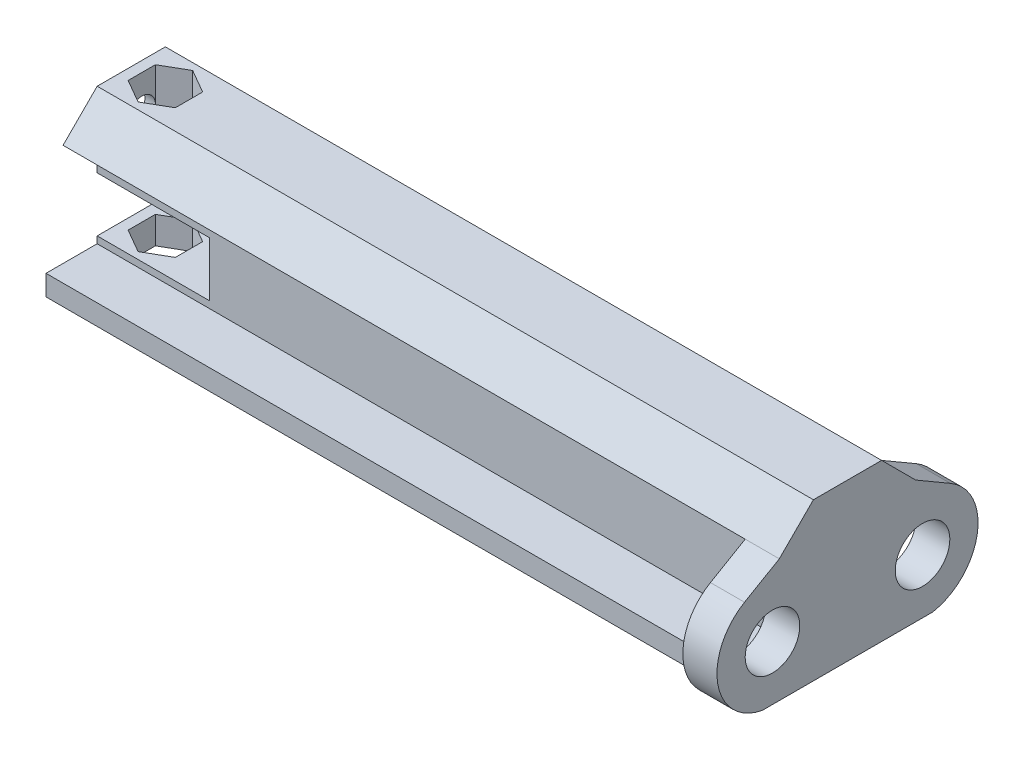
ISO-10303-21;
HEADER;
FILE_DESCRIPTION(('STEP AP214'),'2;1');
FILE_NAME('part.step','',(''),(''),'','','');
FILE_SCHEMA(('AUTOMOTIVE_DESIGN { 1 0 10303 214 1 1 1 1 }'));
ENDSEC;
DATA;
#1=APPLICATION_CONTEXT('core data for automotive mechanical design processes');
#2=APPLICATION_PROTOCOL_DEFINITION('international standard','automotive_design',2000,#1);
#3=PRODUCT_CONTEXT('',#1,'mechanical');
#4=PRODUCT('Part','Part','',(#3));
#5=PRODUCT_RELATED_PRODUCT_CATEGORY('part','',(#4));
#6=PRODUCT_DEFINITION_FORMATION('','',#4);
#7=PRODUCT_DEFINITION_CONTEXT('part definition',#1,'design');
#8=PRODUCT_DEFINITION('design','',#6,#7);
#9=PRODUCT_DEFINITION_SHAPE('','',#8);
#10=(LENGTH_UNIT() NAMED_UNIT(*) SI_UNIT(.MILLI.,.METRE.));
#11=(NAMED_UNIT(*) PLANE_ANGLE_UNIT() SI_UNIT($,.RADIAN.));
#12=(NAMED_UNIT(*) SI_UNIT($,.STERADIAN.) SOLID_ANGLE_UNIT());
#13=UNCERTAINTY_MEASURE_WITH_UNIT(LENGTH_MEASURE(1.E-05),#10,'distance_accuracy_value','');
#14=(GEOMETRIC_REPRESENTATION_CONTEXT(3) GLOBAL_UNCERTAINTY_ASSIGNED_CONTEXT((#13)) GLOBAL_UNIT_ASSIGNED_CONTEXT((#10,
#11,#12)) REPRESENTATION_CONTEXT('',''));
#15=CARTESIAN_POINT('',(0.,0.,0.));
#16=DIRECTION('',(0.,0.,1.));
#17=DIRECTION('',(1.,0.,0.));
#18=AXIS2_PLACEMENT_3D('',#15,#16,#17);
#19=CARTESIAN_POINT('',(-48.4641016151377,-8.,-2.));
#20=DIRECTION('',(-1.,0.,0.));
#21=DIRECTION('',(0.,0.,1.));
#22=AXIS2_PLACEMENT_3D('',#19,#20,#21);
#23=PLANE('',#22);
#24=DIRECTION('',(0.,1.,0.));
#25=VECTOR('',#24,1.);
#26=CARTESIAN_POINT('',(-48.4641016151377,-8.,2.));
#27=LINE('',#26,#25);
#28=CARTESIAN_POINT('',(-48.4641016151377,10.,2.));
#29=VERTEX_POINT('',#28);
#30=CARTESIAN_POINT('',(-48.4641016151377,15.,2.));
#31=VERTEX_POINT('',#30);
#32=EDGE_CURVE('E405',#29,#31,#27,.T.);
#33=ORIENTED_EDGE('',*,*,#32,.F.);
#34=CARTESIAN_POINT('',(-48.4641016151377,10.,0.));
#35=DIRECTION('',(-1.,0.,0.));
#36=DIRECTION('',(0.,0.,1.));
#37=AXIS2_PLACEMENT_3D('',#34,#35,#36);
#38=CIRCLE('',#37,2.);
#39=CARTESIAN_POINT('',(-48.4641016151377,10.,-2.));
#40=VERTEX_POINT('',#39);
#41=EDGE_CURVE('E54',#29,#40,#38,.T.);
#42=ORIENTED_EDGE('',*,*,#41,.T.);
#43=DIRECTION('',(0.,1.,0.));
#44=VECTOR('',#43,1.);
#45=CARTESIAN_POINT('',(-48.4641016151377,-8.,-2.));
#46=LINE('',#45,#44);
#47=CARTESIAN_POINT('',(-48.4641016151377,15.,-2.));
#48=VERTEX_POINT('',#47);
#49=EDGE_CURVE('E411',#40,#48,#46,.T.);
#50=ORIENTED_EDGE('',*,*,#49,.T.);
#51=DIRECTION('',(0.,0.,1.));
#52=VECTOR('',#51,1.);
#53=CARTESIAN_POINT('',(-48.4641016151377,15.,-2.));
#54=LINE('',#53,#52);
#55=EDGE_CURVE('E370',#48,#31,#54,.T.);
#56=ORIENTED_EDGE('',*,*,#55,.T.);
#57=EDGE_LOOP('',(#33,#42,#50,#56));
#58=FACE_BOUND('',#57,.T.);
#59=ADVANCED_FACE('F39',(#58),#23,.F.);
#60=CARTESIAN_POINT('',(50.,5.,-5.));
#61=DIRECTION('',(0.,0.,1.));
#62=DIRECTION('',(1.,0.,0.));
#63=AXIS2_PLACEMENT_3D('',#60,#61,#62);
#64=PLANE('',#63);
#65=DIRECTION('',(-1.,0.,0.));
#66=VECTOR('',#65,1.);
#67=CARTESIAN_POINT('',(50.,-4.,-5.));
#68=LINE('',#67,#66);
#69=CARTESIAN_POINT('',(-33.5435607626104,-4.,-5.));
#70=VERTEX_POINT('',#69);
#71=CARTESIAN_POINT('',(-50.,-4.,-5.));
#72=VERTEX_POINT('',#71);
#73=EDGE_CURVE('E467',#70,#72,#68,.T.);
#74=ORIENTED_EDGE('',*,*,#73,.F.);
#75=DIRECTION('',(0.,1.,0.));
#76=VECTOR('',#75,1.);
#77=CARTESIAN_POINT('',(-33.5435607626104,-4.,-5.));
#78=LINE('',#77,#76);
#79=CARTESIAN_POINT('',(-33.5435607626104,4.,-5.));
#80=VERTEX_POINT('',#79);
#81=EDGE_CURVE('E470',#70,#80,#78,.T.);
#82=ORIENTED_EDGE('',*,*,#81,.T.);
#83=DIRECTION('',(-1.,0.,0.));
#84=VECTOR('',#83,1.);
#85=CARTESIAN_POINT('',(50.,4.,-5.));
#86=LINE('',#85,#84);
#87=CARTESIAN_POINT('',(-50.,4.,-5.));
#88=VERTEX_POINT('',#87);
#89=EDGE_CURVE('E460',#80,#88,#86,.T.);
#90=ORIENTED_EDGE('',*,*,#89,.T.);
#91=DIRECTION('',(0.,1.,0.));
#92=VECTOR('',#91,1.);
#93=CARTESIAN_POINT('',(-50.,5.,-5.));
#94=LINE('',#93,#92);
#95=CARTESIAN_POINT('',(-50.,5.,-5.));
#96=VERTEX_POINT('',#95);
#97=EDGE_CURVE('E512',#88,#96,#94,.T.);
#98=ORIENTED_EDGE('',*,*,#97,.T.);
#99=DIRECTION('',(-1.,0.,0.));
#100=VECTOR('',#99,1.);
#101=CARTESIAN_POINT('',(50.,5.,-5.));
#102=LINE('',#101,#100);
#103=CARTESIAN_POINT('',(50.,5.,-5.));
#104=VERTEX_POINT('',#103);
#105=EDGE_CURVE('E578',#104,#96,#102,.T.);
#106=ORIENTED_EDGE('',*,*,#105,.F.);
#107=DIRECTION('',(0.,1.,0.));
#108=VECTOR('',#107,1.);
#109=CARTESIAN_POINT('',(50.,5.,-5.));
#110=LINE('',#109,#108);
#111=CARTESIAN_POINT('',(50.,-5.,-5.));
#112=VERTEX_POINT('',#111);
#113=EDGE_CURVE('E479',#112,#104,#110,.T.);
#114=ORIENTED_EDGE('',*,*,#113,.F.);
#115=DIRECTION('',(-1.,0.,0.));
#116=VECTOR('',#115,1.);
#117=CARTESIAN_POINT('',(50.,-5.,-5.));
#118=LINE('',#117,#116);
#119=CARTESIAN_POINT('',(-50.,-5.,-5.));
#120=VERTEX_POINT('',#119);
#121=EDGE_CURVE('E582',#112,#120,#118,.T.);
#122=ORIENTED_EDGE('',*,*,#121,.T.);
#123=EDGE_CURVE('E513',#120,#72,#94,.T.);
#124=ORIENTED_EDGE('',*,*,#123,.T.);
#125=EDGE_LOOP('',(#74,#82,#90,#98,#106,#114,#122,#124));
#126=FACE_BOUND('',#125,.T.);
#127=ADVANCED_FACE('F664',(#126),#64,.F.);
#128=CARTESIAN_POINT('',(50.,5.,5.));
#129=DIRECTION('',(0.,0.,-1.));
#130=DIRECTION('',(0.,1.,0.));
#131=AXIS2_PLACEMENT_3D('',#128,#129,#130);
#132=PLANE('',#131);
#133=DIRECTION('',(1.,0.,0.));
#134=VECTOR('',#133,1.);
#135=CARTESIAN_POINT('',(50.,-4.,5.));
#136=LINE('',#135,#134);
#137=CARTESIAN_POINT('',(-50.,-4.,5.));
#138=VERTEX_POINT('',#137);
#139=CARTESIAN_POINT('',(-33.5435607626104,-4.,5.));
#140=VERTEX_POINT('',#139);
#141=EDGE_CURVE('E464',#138,#140,#136,.T.);
#142=ORIENTED_EDGE('',*,*,#141,.F.);
#143=DIRECTION('',(0.,-1.,0.));
#144=VECTOR('',#143,1.);
#145=CARTESIAN_POINT('',(-50.,5.,5.));
#146=LINE('',#145,#144);
#147=CARTESIAN_POINT('',(-50.,-5.,5.));
#148=VERTEX_POINT('',#147);
#149=EDGE_CURVE('E531',#138,#148,#146,.T.);
#150=ORIENTED_EDGE('',*,*,#149,.T.);
#151=DIRECTION('',(-1.,0.,0.));
#152=VECTOR('',#151,1.);
#153=CARTESIAN_POINT('',(50.,-5.,5.));
#154=LINE('',#153,#152);
#155=CARTESIAN_POINT('',(50.,-5.,5.));
#156=VERTEX_POINT('',#155);
#157=EDGE_CURVE('E562',#156,#148,#154,.T.);
#158=ORIENTED_EDGE('',*,*,#157,.F.);
#159=DIRECTION('',(0.,-1.,0.));
#160=VECTOR('',#159,1.);
#161=CARTESIAN_POINT('',(50.,5.,5.));
#162=LINE('',#161,#160);
#163=CARTESIAN_POINT('',(50.,5.,5.));
#164=VERTEX_POINT('',#163);
#165=EDGE_CURVE('E492',#164,#156,#162,.T.);
#166=ORIENTED_EDGE('',*,*,#165,.F.);
#167=DIRECTION('',(-1.,0.,0.));
#168=VECTOR('',#167,1.);
#169=CARTESIAN_POINT('',(50.,5.,5.));
#170=LINE('',#169,#168);
#171=CARTESIAN_POINT('',(-50.,5.,5.));
#172=VERTEX_POINT('',#171);
#173=EDGE_CURVE('E566',#164,#172,#170,.T.);
#174=ORIENTED_EDGE('',*,*,#173,.T.);
#175=CARTESIAN_POINT('',(-50.,4.,5.));
#176=VERTEX_POINT('',#175);
#177=EDGE_CURVE('E532',#172,#176,#146,.T.);
#178=ORIENTED_EDGE('',*,*,#177,.T.);
#179=DIRECTION('',(1.,0.,0.));
#180=VECTOR('',#179,1.);
#181=CARTESIAN_POINT('',(50.,4.,5.));
#182=LINE('',#181,#180);
#183=CARTESIAN_POINT('',(-33.5435607626104,4.,5.));
#184=VERTEX_POINT('',#183);
#185=EDGE_CURVE('E453',#176,#184,#182,.T.);
#186=ORIENTED_EDGE('',*,*,#185,.T.);
#187=DIRECTION('',(0.,1.,0.));
#188=VECTOR('',#187,1.);
#189=CARTESIAN_POINT('',(-33.5435607626104,-4.,5.));
#190=LINE('',#189,#188);
#191=EDGE_CURVE('E593',#184,#140,#190,.F.);
#192=ORIENTED_EDGE('',*,*,#191,.T.);
#193=EDGE_LOOP('',(#142,#150,#158,#166,#174,#178,#186,#192));
#194=FACE_BOUND('',#193,.T.);
#195=ADVANCED_FACE('F671',(#194),#132,.F.);
#196=CARTESIAN_POINT('',(-50.,0.,0.));
#197=DIRECTION('',(-1.,0.,0.));
#198=DIRECTION('',(0.,0.,1.));
#199=AXIS2_PLACEMENT_3D('',#196,#197,#198);
#200=PLANE('',#199);
#201=ORIENTED_EDGE('',*,*,#149,.F.);
#202=DIRECTION('',(0.,0.,-1.));
#203=VECTOR('',#202,1.);
#204=CARTESIAN_POINT('',(-50.,-4.,0.));
#205=LINE('',#204,#203);
#206=EDGE_CURVE('E589',#138,#72,#205,.T.);
#207=ORIENTED_EDGE('',*,*,#206,.T.);
#208=ORIENTED_EDGE('',*,*,#123,.F.);
#209=DIRECTION('',(0.,0.,1.));
#210=VECTOR('',#209,1.);
#211=CARTESIAN_POINT('',(-50.,-5.,-5.));
#212=LINE('',#211,#210);
#213=CARTESIAN_POINT('',(-50.,-5.,-12.5));
#214=VERTEX_POINT('',#213);
#215=EDGE_CURVE('E474',#214,#120,#212,.T.);
#216=ORIENTED_EDGE('',*,*,#215,.F.);
#217=DIRECTION('',(0.,1.,0.));
#218=VECTOR('',#217,1.);
#219=CARTESIAN_POINT('',(-50.,-5.,-12.5));
#220=LINE('',#219,#218);
#221=CARTESIAN_POINT('',(-50.,-8.,-12.5));
#222=VERTEX_POINT('',#221);
#223=EDGE_CURVE('E480',#222,#214,#220,.T.);
#224=ORIENTED_EDGE('',*,*,#223,.F.);
#225=DIRECTION('',(0.,0.,-1.));
#226=VECTOR('',#225,1.);
#227=CARTESIAN_POINT('',(-50.,-8.,12.5));
#228=LINE('',#227,#226);
#229=CARTESIAN_POINT('',(-50.,-8.,12.5));
#230=VERTEX_POINT('',#229);
#231=EDGE_CURVE('E542',#230,#222,#228,.T.);
#232=ORIENTED_EDGE('',*,*,#231,.F.);
#233=DIRECTION('',(0.,-1.,0.));
#234=VECTOR('',#233,1.);
#235=CARTESIAN_POINT('',(-50.,-5.,12.5));
#236=LINE('',#235,#234);
#237=CARTESIAN_POINT('',(-50.,-5.,12.5));
#238=VERTEX_POINT('',#237);
#239=EDGE_CURVE('E539',#238,#230,#236,.T.);
#240=ORIENTED_EDGE('',*,*,#239,.F.);
#241=DIRECTION('',(0.,0.,1.));
#242=VECTOR('',#241,1.);
#243=CARTESIAN_POINT('',(-50.,-5.,5.));
#244=LINE('',#243,#242);
#245=EDGE_CURVE('E536',#148,#238,#244,.T.);
#246=ORIENTED_EDGE('',*,*,#245,.F.);
#247=EDGE_LOOP('',(#201,#207,#208,#216,#224,#232,#240,#246));
#248=FACE_BOUND('',#247,.T.);
#249=ADVANCED_FACE('F968',(#248),#200,.T.);
#250=CARTESIAN_POINT('',(50.,-5.,-5.));
#251=DIRECTION('',(0.,-1.,0.));
#252=DIRECTION('',(0.,0.,-1.));
#253=AXIS2_PLACEMENT_3D('',#250,#251,#252);
#254=PLANE('',#253);
#255=ORIENTED_EDGE('',*,*,#215,.T.);
#256=ORIENTED_EDGE('',*,*,#121,.F.);
#257=DIRECTION('',(0.,0.,1.));
#258=VECTOR('',#257,1.);
#259=CARTESIAN_POINT('',(50.,-5.,-5.));
#260=LINE('',#259,#258);
#261=CARTESIAN_POINT('',(50.,-5.,-12.5));
#262=VERTEX_POINT('',#261);
#263=EDGE_CURVE('E475',#262,#112,#260,.T.);
#264=ORIENTED_EDGE('',*,*,#263,.F.);
#265=DIRECTION('',(-1.,0.,0.));
#266=VECTOR('',#265,1.);
#267=CARTESIAN_POINT('',(50.,-5.,-12.5));
#268=LINE('',#267,#266);
#269=EDGE_CURVE('E508',#262,#214,#268,.T.);
#270=ORIENTED_EDGE('',*,*,#269,.T.);
#271=EDGE_LOOP('',(#255,#256,#264,#270));
#272=FACE_BOUND('',#271,.T.);
#273=ADVANCED_FACE('F41',(#272),#254,.F.);
#274=CARTESIAN_POINT('',(50.,5.,-5.));
#275=DIRECTION('',(0.,0.707106781186548,0.707106781186548));
#276=DIRECTION('',(0.,-0.707106781186548,0.707106781186548));
#277=AXIS2_PLACEMENT_3D('',#274,#275,#276);
#278=PLANE('',#277);
#279=DIRECTION('',(0.,0.707106781186548,-0.707106781186548));
#280=VECTOR('',#279,1.);
#281=CARTESIAN_POINT('',(-50.,5.,-5.));
#282=LINE('',#281,#280);
#283=CARTESIAN_POINT('',(-50.,10.,-10.));
#284=VERTEX_POINT('',#283);
#285=EDGE_CURVE('E517',#96,#284,#282,.T.);
#286=ORIENTED_EDGE('',*,*,#285,.T.);
#287=DIRECTION('',(-1.,0.,0.));
#288=VECTOR('',#287,1.);
#289=CARTESIAN_POINT('',(50.,10.,-10.));
#290=LINE('',#289,#288);
#291=CARTESIAN_POINT('',(50.,10.,-10.));
#292=VERTEX_POINT('',#291);
#293=EDGE_CURVE('E268',#292,#284,#290,.T.);
#294=ORIENTED_EDGE('',*,*,#293,.F.);
#295=DIRECTION('',(0.,0.707106781186548,-0.707106781186548));
#296=VECTOR('',#295,1.);
#297=CARTESIAN_POINT('',(50.,5.,-5.));
#298=LINE('',#297,#296);
#299=EDGE_CURVE('E484',#104,#292,#298,.T.);
#300=ORIENTED_EDGE('',*,*,#299,.F.);
#301=ORIENTED_EDGE('',*,*,#105,.T.);
#302=EDGE_LOOP('',(#286,#294,#300,#301));
#303=FACE_BOUND('',#302,.T.);
#304=ADVANCED_FACE('F737',(#303),#278,.F.);
#305=CARTESIAN_POINT('',(50.,10.,-10.));
#306=DIRECTION('',(0.,-0.707106781186548,0.707106781186547));
#307=DIRECTION('',(0.,-0.707106781186547,-0.707106781186548));
#308=AXIS2_PLACEMENT_3D('',#305,#306,#307);
#309=PLANE('',#308);
#310=DIRECTION('',(0.,0.707106781186547,0.707106781186548));
#311=VECTOR('',#310,1.);
#312=CARTESIAN_POINT('',(-50.,10.,-10.));
#313=LINE('',#312,#311);
#314=CARTESIAN_POINT('',(-50.,15.,-5.));
#315=VERTEX_POINT('',#314);
#316=EDGE_CURVE('E264',#284,#315,#313,.T.);
#317=ORIENTED_EDGE('',*,*,#316,.T.);
#318=DIRECTION('',(-1.,0.,0.));
#319=VECTOR('',#318,1.);
#320=CARTESIAN_POINT('',(50.,15.,-5.));
#321=LINE('',#320,#319);
#322=CARTESIAN_POINT('',(55.,15.,-5.));
#323=VERTEX_POINT('',#322);
#324=EDGE_CURVE('E256',#323,#315,#321,.T.);
#325=ORIENTED_EDGE('',*,*,#324,.F.);
#326=DIRECTION('',(0.,0.707106781186547,0.707106781186548));
#327=VECTOR('',#326,1.);
#328=CARTESIAN_POINT('',(55.,15.,-5.));
#329=LINE('',#328,#327);
#330=CARTESIAN_POINT('',(55.,10.,-10.));
#331=VERTEX_POINT('',#330);
#332=EDGE_CURVE('E261',#331,#323,#329,.T.);
#333=ORIENTED_EDGE('',*,*,#332,.F.);
#334=DIRECTION('',(-1.,0.,0.));
#335=VECTOR('',#334,1.);
#336=CARTESIAN_POINT('',(55.,10.,-10.));
#337=LINE('',#336,#335);
#338=EDGE_CURVE('E312',#331,#292,#337,.T.);
#339=ORIENTED_EDGE('',*,*,#338,.T.);
#340=ORIENTED_EDGE('',*,*,#293,.T.);
#341=EDGE_LOOP('',(#317,#325,#333,#339,#340));
#342=FACE_BOUND('',#341,.T.);
#343=ADVANCED_FACE('F258',(#342),#309,.F.);
#344=CARTESIAN_POINT('',(50.,15.,-5.));
#345=DIRECTION('',(0.,-1.,0.));
#346=DIRECTION('',(0.,0.,-1.));
#347=AXIS2_PLACEMENT_3D('',#344,#345,#346);
#348=PLANE('',#347);
#349=DIRECTION('',(0.866025403784438,0.,-0.500000000000001));
#350=VECTOR('',#349,1.);
#351=CARTESIAN_POINT('',(-45.,15.,4.));
#352=LINE('',#351,#350);
#353=CARTESIAN_POINT('',(-45.,15.,4.));
#354=VERTEX_POINT('',#353);
#355=CARTESIAN_POINT('',(-41.5358983848622,15.,1.99999999999999));
#356=VERTEX_POINT('',#355);
#357=EDGE_CURVE('E354',#354,#356,#352,.T.);
#358=ORIENTED_EDGE('',*,*,#357,.F.);
#359=DIRECTION('',(0.866025403784438,0.,0.5));
#360=VECTOR('',#359,1.);
#361=CARTESIAN_POINT('',(-48.4641016151377,15.,2.));
#362=LINE('',#361,#360);
#363=EDGE_CURVE('E62',#31,#354,#362,.T.);
#364=ORIENTED_EDGE('',*,*,#363,.F.);
#365=ORIENTED_EDGE('',*,*,#55,.F.);
#366=DIRECTION('',(-0.866025403784439,0.,0.5));
#367=VECTOR('',#366,1.);
#368=CARTESIAN_POINT('',(-45.,15.,-4.));
#369=LINE('',#368,#367);
#370=CARTESIAN_POINT('',(-45.,15.,-4.));
#371=VERTEX_POINT('',#370);
#372=EDGE_CURVE('E366',#371,#48,#369,.T.);
#373=ORIENTED_EDGE('',*,*,#372,.F.);
#374=DIRECTION('',(-0.866025403784438,0.,-0.5));
#375=VECTOR('',#374,1.);
#376=CARTESIAN_POINT('',(-41.5358983848622,15.,-2.));
#377=LINE('',#376,#375);
#378=CARTESIAN_POINT('',(-41.5358983848622,15.,-2.));
#379=VERTEX_POINT('',#378);
#380=EDGE_CURVE('E362',#379,#371,#377,.T.);
#381=ORIENTED_EDGE('',*,*,#380,.F.);
#382=DIRECTION('',(0.,0.,-1.));
#383=VECTOR('',#382,1.);
#384=CARTESIAN_POINT('',(-41.5358983848622,15.,1.99999999999999));
#385=LINE('',#384,#383);
#386=EDGE_CURVE('E358',#356,#379,#385,.T.);
#387=ORIENTED_EDGE('',*,*,#386,.F.);
#388=EDGE_LOOP('',(#358,#364,#365,#373,#381,#387));
#389=FACE_BOUND('',#388,.T.);
#390=DIRECTION('',(0.,0.,1.));
#391=VECTOR('',#390,1.);
#392=CARTESIAN_POINT('',(-50.,15.,-5.));
#393=LINE('',#392,#391);
#394=CARTESIAN_POINT('',(-50.,15.,5.));
#395=VERTEX_POINT('',#394);
#396=EDGE_CURVE('E522',#315,#395,#393,.T.);
#397=ORIENTED_EDGE('',*,*,#396,.T.);
#398=DIRECTION('',(-1.,0.,0.));
#399=VECTOR('',#398,1.);
#400=CARTESIAN_POINT('',(50.,15.,5.));
#401=LINE('',#400,#399);
#402=CARTESIAN_POINT('',(55.,15.,5.));
#403=VERTEX_POINT('',#402);
#404=EDGE_CURVE('E269',#403,#395,#401,.T.);
#405=ORIENTED_EDGE('',*,*,#404,.F.);
#406=DIRECTION('',(0.,0.,1.));
#407=VECTOR('',#406,1.);
#408=CARTESIAN_POINT('',(55.,15.,5.));
#409=LINE('',#408,#407);
#410=EDGE_CURVE('E272',#323,#403,#409,.T.);
#411=ORIENTED_EDGE('',*,*,#410,.F.);
#412=ORIENTED_EDGE('',*,*,#324,.T.);
#413=EDGE_LOOP('',(#397,#405,#411,#412));
#414=FACE_BOUND('',#413,.T.);
#415=ADVANCED_FACE('F273',(#389,#414),#348,.F.);
#416=CARTESIAN_POINT('',(50.,15.,5.));
#417=DIRECTION('',(0.,-0.707106781186547,-0.707106781186548));
#418=DIRECTION('',(0.,0.707106781186548,-0.707106781186547));
#419=AXIS2_PLACEMENT_3D('',#416,#417,#418);
#420=PLANE('',#419);
#421=DIRECTION('',(0.,-0.707106781186548,0.707106781186547));
#422=VECTOR('',#421,1.);
#423=CARTESIAN_POINT('',(-50.,15.,5.));
#424=LINE('',#423,#422);
#425=CARTESIAN_POINT('',(-50.,9.99999999999999,10.));
#426=VERTEX_POINT('',#425);
#427=EDGE_CURVE('E525',#395,#426,#424,.T.);
#428=ORIENTED_EDGE('',*,*,#427,.T.);
#429=DIRECTION('',(-1.,0.,0.));
#430=VECTOR('',#429,1.);
#431=CARTESIAN_POINT('',(50.,9.99999999999999,10.));
#432=LINE('',#431,#430);
#433=CARTESIAN_POINT('',(50.,9.99999999999999,10.));
#434=VERTEX_POINT('',#433);
#435=EDGE_CURVE('E570',#434,#426,#432,.T.);
#436=ORIENTED_EDGE('',*,*,#435,.F.);
#437=DIRECTION('',(-1.,0.,0.));
#438=VECTOR('',#437,1.);
#439=CARTESIAN_POINT('',(55.,10.,10.));
#440=LINE('',#439,#438);
#441=CARTESIAN_POINT('',(55.,10.,10.));
#442=VERTEX_POINT('',#441);
#443=EDGE_CURVE('E341',#442,#434,#440,.T.);
#444=ORIENTED_EDGE('',*,*,#443,.F.);
#445=DIRECTION('',(0.,-0.707106781186548,0.707106781186547));
#446=VECTOR('',#445,1.);
#447=CARTESIAN_POINT('',(55.,10.,10.));
#448=LINE('',#447,#446);
#449=EDGE_CURVE('E278',#403,#442,#448,.T.);
#450=ORIENTED_EDGE('',*,*,#449,.F.);
#451=ORIENTED_EDGE('',*,*,#404,.T.);
#452=EDGE_LOOP('',(#428,#436,#444,#450,#451));
#453=FACE_BOUND('',#452,.T.);
#454=ADVANCED_FACE('F745',(#453),#420,.F.);
#455=CARTESIAN_POINT('',(50.,9.99999999999999,10.));
#456=DIRECTION('',(0.,0.707106781186548,-0.707106781186547));
#457=DIRECTION('',(0.,0.707106781186547,0.707106781186548));
#458=AXIS2_PLACEMENT_3D('',#455,#456,#457);
#459=PLANE('',#458);
#460=DIRECTION('',(0.,-0.707106781186547,-0.707106781186548));
#461=VECTOR('',#460,1.);
#462=CARTESIAN_POINT('',(-50.,9.99999999999999,10.));
#463=LINE('',#462,#461);
#464=EDGE_CURVE('E528',#426,#172,#463,.T.);
#465=ORIENTED_EDGE('',*,*,#464,.T.);
#466=ORIENTED_EDGE('',*,*,#173,.F.);
#467=DIRECTION('',(0.,-0.707106781186547,-0.707106781186548));
#468=VECTOR('',#467,1.);
#469=CARTESIAN_POINT('',(50.,9.99999999999999,10.));
#470=LINE('',#469,#468);
#471=EDGE_CURVE('E488',#434,#164,#470,.T.);
#472=ORIENTED_EDGE('',*,*,#471,.F.);
#473=ORIENTED_EDGE('',*,*,#435,.T.);
#474=EDGE_LOOP('',(#465,#466,#472,#473));
#475=FACE_BOUND('',#474,.T.);
#476=ADVANCED_FACE('F752',(#475),#459,.F.);
#477=CARTESIAN_POINT('',(50.,-5.,5.));
#478=DIRECTION('',(0.,-1.,0.));
#479=DIRECTION('',(0.,0.,-1.));
#480=AXIS2_PLACEMENT_3D('',#477,#478,#479);
#481=PLANE('',#480);
#482=ORIENTED_EDGE('',*,*,#245,.T.);
#483=DIRECTION('',(-1.,0.,0.));
#484=VECTOR('',#483,1.);
#485=CARTESIAN_POINT('',(50.,-5.,12.5));
#486=LINE('',#485,#484);
#487=CARTESIAN_POINT('',(50.,-5.,12.5));
#488=VERTEX_POINT('',#487);
#489=EDGE_CURVE('E558',#488,#238,#486,.T.);
#490=ORIENTED_EDGE('',*,*,#489,.F.);
#491=DIRECTION('',(0.,0.,1.));
#492=VECTOR('',#491,1.);
#493=CARTESIAN_POINT('',(50.,-5.,5.));
#494=LINE('',#493,#492);
#495=EDGE_CURVE('E496',#156,#488,#494,.T.);
#496=ORIENTED_EDGE('',*,*,#495,.F.);
#497=ORIENTED_EDGE('',*,*,#157,.T.);
#498=EDGE_LOOP('',(#482,#490,#496,#497));
#499=FACE_BOUND('',#498,.T.);
#500=ADVANCED_FACE('F999',(#499),#481,.F.);
#501=CARTESIAN_POINT('',(50.,-5.,12.5));
#502=DIRECTION('',(0.,0.,-1.));
#503=DIRECTION('',(-1.,0.,0.));
#504=AXIS2_PLACEMENT_3D('',#501,#502,#503);
#505=PLANE('',#504);
#506=ORIENTED_EDGE('',*,*,#239,.T.);
#507=DIRECTION('',(-1.,0.,0.));
#508=VECTOR('',#507,1.);
#509=CARTESIAN_POINT('',(50.,-8.,12.5));
#510=LINE('',#509,#508);
#511=CARTESIAN_POINT('',(50.,-8.,12.5));
#512=VERTEX_POINT('',#511);
#513=EDGE_CURVE('E554',#512,#230,#510,.T.);
#514=ORIENTED_EDGE('',*,*,#513,.F.);
#515=DIRECTION('',(0.,-1.,0.));
#516=VECTOR('',#515,1.);
#517=CARTESIAN_POINT('',(50.,-5.,12.5));
#518=LINE('',#517,#516);
#519=EDGE_CURVE('E500',#488,#512,#518,.T.);
#520=ORIENTED_EDGE('',*,*,#519,.F.);
#521=ORIENTED_EDGE('',*,*,#489,.T.);
#522=EDGE_LOOP('',(#506,#514,#520,#521));
#523=FACE_BOUND('',#522,.T.);
#524=ADVANCED_FACE('F762',(#523),#505,.F.);
#525=CARTESIAN_POINT('',(50.,-8.,12.5));
#526=DIRECTION('',(0.,1.,0.));
#527=DIRECTION('',(0.,0.,1.));
#528=AXIS2_PLACEMENT_3D('',#525,#526,#527);
#529=PLANE('',#528);
#530=DIRECTION('',(0.,0.,1.));
#531=VECTOR('',#530,1.);
#532=CARTESIAN_POINT('',(-48.4641016151377,-8.,-2.));
#533=LINE('',#532,#531);
#534=CARTESIAN_POINT('',(-48.4641016151377,-8.,-2.));
#535=VERTEX_POINT('',#534);
#536=CARTESIAN_POINT('',(-48.4641016151377,-8.,2.));
#537=VERTEX_POINT('',#536);
#538=EDGE_CURVE('E394',#535,#537,#533,.T.);
#539=ORIENTED_EDGE('',*,*,#538,.T.);
#540=DIRECTION('',(0.866025403784438,0.,0.5));
#541=VECTOR('',#540,1.);
#542=CARTESIAN_POINT('',(-48.4641016151377,-8.,2.));
#543=LINE('',#542,#541);
#544=CARTESIAN_POINT('',(-45.,-8.,4.));
#545=VERTEX_POINT('',#544);
#546=EDGE_CURVE('E374',#537,#545,#543,.T.);
#547=ORIENTED_EDGE('',*,*,#546,.T.);
#548=DIRECTION('',(0.866025403784438,0.,-0.500000000000001));
#549=VECTOR('',#548,1.);
#550=CARTESIAN_POINT('',(-45.,-8.,4.));
#551=LINE('',#550,#549);
#552=CARTESIAN_POINT('',(-41.5358983848622,-8.,1.99999999999997));
#553=VERTEX_POINT('',#552);
#554=EDGE_CURVE('E378',#545,#553,#551,.T.);
#555=ORIENTED_EDGE('',*,*,#554,.T.);
#556=DIRECTION('',(0.,0.,-1.));
#557=VECTOR('',#556,1.);
#558=CARTESIAN_POINT('',(-41.5358983848622,-8.,1.99999999999999));
#559=LINE('',#558,#557);
#560=CARTESIAN_POINT('',(-41.5358983848622,-8.,-2.));
#561=VERTEX_POINT('',#560);
#562=EDGE_CURVE('E382',#553,#561,#559,.T.);
#563=ORIENTED_EDGE('',*,*,#562,.T.);
#564=DIRECTION('',(-0.866025403784438,0.,-0.5));
#565=VECTOR('',#564,1.);
#566=CARTESIAN_POINT('',(-41.5358983848622,-8.,-2.));
#567=LINE('',#566,#565);
#568=CARTESIAN_POINT('',(-45.,-8.,-4.));
#569=VERTEX_POINT('',#568);
#570=EDGE_CURVE('E386',#561,#569,#567,.T.);
#571=ORIENTED_EDGE('',*,*,#570,.T.);
#572=DIRECTION('',(-0.866025403784439,0.,0.5));
#573=VECTOR('',#572,1.);
#574=CARTESIAN_POINT('',(-45.,-8.,-4.));
#575=LINE('',#574,#573);
#576=EDGE_CURVE('E390',#569,#535,#575,.T.);
#577=ORIENTED_EDGE('',*,*,#576,.T.);
#578=EDGE_LOOP('',(#539,#547,#555,#563,#571,#577));
#579=FACE_BOUND('',#578,.T.);
#580=ORIENTED_EDGE('',*,*,#231,.T.);
#581=DIRECTION('',(-1.,0.,0.));
#582=VECTOR('',#581,1.);
#583=CARTESIAN_POINT('',(50.,-8.,-12.5));
#584=LINE('',#583,#582);
#585=CARTESIAN_POINT('',(50.,-8.,-12.5));
#586=VERTEX_POINT('',#585);
#587=EDGE_CURVE('E550',#586,#222,#584,.T.);
#588=ORIENTED_EDGE('',*,*,#587,.F.);
#589=DIRECTION('',(-1.,0.,0.));
#590=VECTOR('',#589,1.);
#591=CARTESIAN_POINT('',(55.,-8.,-12.5));
#592=LINE('',#591,#590);
#593=CARTESIAN_POINT('',(55.,-8.,-12.5));
#594=VERTEX_POINT('',#593);
#595=EDGE_CURVE('E329',#594,#586,#592,.T.);
#596=ORIENTED_EDGE('',*,*,#595,.F.);
#597=DIRECTION('',(0.,0.,-1.));
#598=VECTOR('',#597,1.);
#599=CARTESIAN_POINT('',(55.,-8.,12.5));
#600=LINE('',#599,#598);
#601=CARTESIAN_POINT('',(55.,-8.,12.5));
#602=VERTEX_POINT('',#601);
#603=EDGE_CURVE('E304',#602,#594,#600,.T.);
#604=ORIENTED_EDGE('',*,*,#603,.F.);
#605=DIRECTION('',(-1.,0.,0.));
#606=VECTOR('',#605,1.);
#607=CARTESIAN_POINT('',(55.,-8.,12.5));
#608=LINE('',#607,#606);
#609=EDGE_CURVE('E333',#602,#512,#608,.T.);
#610=ORIENTED_EDGE('',*,*,#609,.T.);
#611=ORIENTED_EDGE('',*,*,#513,.T.);
#612=EDGE_LOOP('',(#580,#588,#596,#604,#610,#611));
#613=FACE_BOUND('',#612,.T.);
#614=ADVANCED_FACE('F704',(#579,#613),#529,.F.);
#615=CARTESIAN_POINT('',(50.,-5.,-12.5));
#616=DIRECTION('',(0.,0.,1.));
#617=DIRECTION('',(1.,0.,0.));
#618=AXIS2_PLACEMENT_3D('',#615,#616,#617);
#619=PLANE('',#618);
#620=ORIENTED_EDGE('',*,*,#223,.T.);
#621=ORIENTED_EDGE('',*,*,#269,.F.);
#622=DIRECTION('',(0.,1.,0.));
#623=VECTOR('',#622,1.);
#624=CARTESIAN_POINT('',(50.,-5.,-12.5));
#625=LINE('',#624,#623);
#626=EDGE_CURVE('E504',#586,#262,#625,.T.);
#627=ORIENTED_EDGE('',*,*,#626,.F.);
#628=ORIENTED_EDGE('',*,*,#587,.T.);
#629=EDGE_LOOP('',(#620,#621,#627,#628));
#630=FACE_BOUND('',#629,.T.);
#631=ADVANCED_FACE('F761',(#630),#619,.F.);
#632=CARTESIAN_POINT('',(-50.,10.,0.));
#633=DIRECTION('',(-1.,0.,0.));
#634=DIRECTION('',(0.,0.,1.));
#635=AXIS2_PLACEMENT_3D('',#632,#633,#634);
#636=CIRCLE('',#635,2.);
#637=CARTESIAN_POINT('',(-50.,10.,2.));
#638=VERTEX_POINT('',#637);
#639=EDGE_CURVE('E345',#638,#638,#636,.T.);
#640=ORIENTED_EDGE('',*,*,#639,.F.);
#641=EDGE_LOOP('',(#640));
#642=FACE_BOUND('',#641,.T.);
#643=DIRECTION('',(0.,0.,-1.));
#644=VECTOR('',#643,1.);
#645=CARTESIAN_POINT('',(-50.,4.,0.));
#646=LINE('',#645,#644);
#647=EDGE_CURVE('E586',#176,#88,#646,.T.);
#648=ORIENTED_EDGE('',*,*,#647,.F.);
#649=ORIENTED_EDGE('',*,*,#177,.F.);
#650=ORIENTED_EDGE('',*,*,#464,.F.);
#651=ORIENTED_EDGE('',*,*,#427,.F.);
#652=ORIENTED_EDGE('',*,*,#396,.F.);
#653=ORIENTED_EDGE('',*,*,#316,.F.);
#654=ORIENTED_EDGE('',*,*,#285,.F.);
#655=ORIENTED_EDGE('',*,*,#97,.F.);
#656=EDGE_LOOP('',(#648,#649,#650,#651,#652,#653,#654,#655));
#657=FACE_BOUND('',#656,.T.);
#658=ADVANCED_FACE('F954',(#642,#657),#200,.T.);
#659=CARTESIAN_POINT('',(-45.,-4.,0.));
#660=DIRECTION('',(0.,1.,0.));
#661=DIRECTION('',(0.,0.,1.));
#662=AXIS2_PLACEMENT_3D('',#659,#660,#661);
#663=CYLINDRICAL_SURFACE('',#662,12.5);
#664=CARTESIAN_POINT('',(-45.,-4.,0.));
#665=DIRECTION('',(0.,1.,0.));
#666=DIRECTION('',(0.,0.,1.));
#667=AXIS2_PLACEMENT_3D('',#664,#665,#666);
#668=CIRCLE('',#667,12.5);
#669=EDGE_CURVE('E449',#140,#70,#668,.T.);
#670=ORIENTED_EDGE('',*,*,#669,.F.);
#671=ORIENTED_EDGE('',*,*,#191,.F.);
#672=CARTESIAN_POINT('',(-45.,4.,0.));
#673=DIRECTION('',(0.,1.,0.));
#674=DIRECTION('',(0.,0.,1.));
#675=AXIS2_PLACEMENT_3D('',#672,#673,#674);
#676=CIRCLE('',#675,12.5);
#677=EDGE_CURVE('E448',#184,#80,#676,.T.);
#678=ORIENTED_EDGE('',*,*,#677,.T.);
#679=ORIENTED_EDGE('',*,*,#81,.F.);
#680=EDGE_LOOP('',(#670,#671,#678,#679));
#681=FACE_BOUND('',#680,.T.);
#682=ADVANCED_FACE('F946',(#681),#663,.F.);
#683=CARTESIAN_POINT('',(0.,-4.,0.));
#684=DIRECTION('',(0.,1.,0.));
#685=DIRECTION('',(0.,0.,1.));
#686=AXIS2_PLACEMENT_3D('',#683,#684,#685);
#687=PLANE('',#686);
#688=DIRECTION('',(0.866025403784439,0.,0.5));
#689=VECTOR('',#688,1.);
#690=CARTESIAN_POINT('',(-12.9820508075689,-4.,22.4855715851499));
#691=LINE('',#690,#689);
#692=CARTESIAN_POINT('',(-48.4641016151377,-4.,2.));
#693=VERTEX_POINT('',#692);
#694=CARTESIAN_POINT('',(-45.,-4.,4.));
#695=VERTEX_POINT('',#694);
#696=EDGE_CURVE('E444',#693,#695,#691,.T.);
#697=ORIENTED_EDGE('',*,*,#696,.F.);
#698=DIRECTION('',(0.,0.,1.));
#699=VECTOR('',#698,1.);
#700=CARTESIAN_POINT('',(-48.4641016151377,-4.,0.));
#701=LINE('',#700,#699);
#702=CARTESIAN_POINT('',(-48.4641016151377,-4.,-2.));
#703=VERTEX_POINT('',#702);
#704=EDGE_CURVE('E441',#703,#693,#701,.T.);
#705=ORIENTED_EDGE('',*,*,#704,.F.);
#706=DIRECTION('',(-0.866025403784439,0.,0.5));
#707=VECTOR('',#706,1.);
#708=CARTESIAN_POINT('',(-12.9820508075689,-4.,-22.4855715851499));
#709=LINE('',#708,#707);
#710=CARTESIAN_POINT('',(-45.,-4.,-4.));
#711=VERTEX_POINT('',#710);
#712=EDGE_CURVE('E438',#711,#703,#709,.T.);
#713=ORIENTED_EDGE('',*,*,#712,.F.);
#714=DIRECTION('',(-0.866025403784438,0.,-0.5));
#715=VECTOR('',#714,1.);
#716=CARTESIAN_POINT('',(-9.51794919243114,-4.,16.4855715851499));
#717=LINE('',#716,#715);
#718=CARTESIAN_POINT('',(-41.5358983848622,-4.,-2.));
#719=VERTEX_POINT('',#718);
#720=EDGE_CURVE('E435',#719,#711,#717,.T.);
#721=ORIENTED_EDGE('',*,*,#720,.F.);
#722=DIRECTION('',(0.,0.,-1.));
#723=VECTOR('',#722,1.);
#724=CARTESIAN_POINT('',(-41.5358983848622,-4.,0.));
#725=LINE('',#724,#723);
#726=CARTESIAN_POINT('',(-41.5358983848622,-4.,1.99999999999999));
#727=VERTEX_POINT('',#726);
#728=EDGE_CURVE('E432',#727,#719,#725,.T.);
#729=ORIENTED_EDGE('',*,*,#728,.F.);
#730=DIRECTION('',(0.866025403784438,0.,-0.500000000000001));
#731=VECTOR('',#730,1.);
#732=CARTESIAN_POINT('',(-9.51794919243115,-4.,-16.4855715851499));
#733=LINE('',#732,#731);
#734=EDGE_CURVE('E403',#695,#727,#733,.T.);
#735=ORIENTED_EDGE('',*,*,#734,.F.);
#736=EDGE_LOOP('',(#697,#705,#713,#721,#729,#735));
#737=FACE_BOUND('',#736,.T.);
#738=ORIENTED_EDGE('',*,*,#73,.T.);
#739=ORIENTED_EDGE('',*,*,#206,.F.);
#740=ORIENTED_EDGE('',*,*,#141,.T.);
#741=ORIENTED_EDGE('',*,*,#669,.T.);
#742=EDGE_LOOP('',(#738,#739,#740,#741));
#743=FACE_BOUND('',#742,.T.);
#744=ADVANCED_FACE('F695',(#737,#743),#687,.T.);
#745=CARTESIAN_POINT('',(0.,4.,0.));
#746=DIRECTION('',(0.,1.,0.));
#747=DIRECTION('',(0.,0.,1.));
#748=AXIS2_PLACEMENT_3D('',#745,#746,#747);
#749=PLANE('',#748);
#750=DIRECTION('',(0.,0.,1.));
#751=VECTOR('',#750,1.);
#752=CARTESIAN_POINT('',(-48.4641016151377,4.,0.));
#753=LINE('',#752,#751);
#754=CARTESIAN_POINT('',(-48.4641016151377,4.,-2.));
#755=VERTEX_POINT('',#754);
#756=CARTESIAN_POINT('',(-48.4641016151377,4.,2.));
#757=VERTEX_POINT('',#756);
#758=EDGE_CURVE('E48',#755,#757,#753,.T.);
#759=ORIENTED_EDGE('',*,*,#758,.T.);
#760=DIRECTION('',(0.866025403784439,0.,0.5));
#761=VECTOR('',#760,1.);
#762=CARTESIAN_POINT('',(-12.9820508075689,4.,22.4855715851499));
#763=LINE('',#762,#761);
#764=CARTESIAN_POINT('',(-45.,4.,4.));
#765=VERTEX_POINT('',#764);
#766=EDGE_CURVE('E11',#757,#765,#763,.T.);
#767=ORIENTED_EDGE('',*,*,#766,.T.);
#768=DIRECTION('',(0.866025403784438,0.,-0.500000000000001));
#769=VECTOR('',#768,1.);
#770=CARTESIAN_POINT('',(-9.51794919243115,4.,-16.4855715851499));
#771=LINE('',#770,#769);
#772=CARTESIAN_POINT('',(-41.5358983848622,4.,1.99999999999999));
#773=VERTEX_POINT('',#772);
#774=EDGE_CURVE('E597',#765,#773,#771,.T.);
#775=ORIENTED_EDGE('',*,*,#774,.T.);
#776=DIRECTION('',(0.,0.,-1.));
#777=VECTOR('',#776,1.);
#778=CARTESIAN_POINT('',(-41.5358983848622,4.,0.));
#779=LINE('',#778,#777);
#780=CARTESIAN_POINT('',(-41.5358983848622,4.,-2.));
#781=VERTEX_POINT('',#780);
#782=EDGE_CURVE('E601',#773,#781,#779,.T.);
#783=ORIENTED_EDGE('',*,*,#782,.T.);
#784=DIRECTION('',(-0.866025403784438,0.,-0.5));
#785=VECTOR('',#784,1.);
#786=CARTESIAN_POINT('',(-9.51794919243114,4.,16.4855715851499));
#787=LINE('',#786,#785);
#788=CARTESIAN_POINT('',(-45.,4.,-4.));
#789=VERTEX_POINT('',#788);
#790=EDGE_CURVE('E605',#781,#789,#787,.T.);
#791=ORIENTED_EDGE('',*,*,#790,.T.);
#792=DIRECTION('',(-0.866025403784439,0.,0.5));
#793=VECTOR('',#792,1.);
#794=CARTESIAN_POINT('',(-12.9820508075689,4.,-22.4855715851499));
#795=LINE('',#794,#793);
#796=EDGE_CURVE('E609',#789,#755,#795,.T.);
#797=ORIENTED_EDGE('',*,*,#796,.T.);
#798=EDGE_LOOP('',(#759,#767,#775,#783,#791,#797));
#799=FACE_BOUND('',#798,.T.);
#800=ORIENTED_EDGE('',*,*,#677,.F.);
#801=ORIENTED_EDGE('',*,*,#185,.F.);
#802=ORIENTED_EDGE('',*,*,#647,.T.);
#803=ORIENTED_EDGE('',*,*,#89,.F.);
#804=EDGE_LOOP('',(#800,#801,#802,#803));
#805=FACE_BOUND('',#804,.T.);
#806=ADVANCED_FACE('F615',(#799,#805),#749,.F.);
#807=CARTESIAN_POINT('',(-45.,-8.,4.));
#808=DIRECTION('',(0.500000000000001,0.,0.866025403784438));
#809=DIRECTION('',(0.866025403784438,0.,-0.500000000000001));
#810=AXIS2_PLACEMENT_3D('',#807,#808,#809);
#811=PLANE('',#810);
#812=DIRECTION('',(0.,1.,0.));
#813=VECTOR('',#812,1.);
#814=CARTESIAN_POINT('',(-45.,-8.,4.));
#815=LINE('',#814,#813);
#816=EDGE_CURVE('E398',#765,#354,#815,.T.);
#817=ORIENTED_EDGE('',*,*,#816,.T.);
#818=ORIENTED_EDGE('',*,*,#357,.T.);
#819=DIRECTION('',(0.,1.,0.));
#820=VECTOR('',#819,1.);
#821=CARTESIAN_POINT('',(-41.5358983848622,-8.,1.99999999999999));
#822=LINE('',#821,#820);
#823=EDGE_CURVE('E426',#773,#356,#822,.T.);
#824=ORIENTED_EDGE('',*,*,#823,.F.);
#825=ORIENTED_EDGE('',*,*,#774,.F.);
#826=EDGE_LOOP('',(#817,#818,#824,#825));
#827=FACE_BOUND('',#826,.T.);
#828=ADVANCED_FACE('F638',(#827),#811,.F.);
#829=CARTESIAN_POINT('',(-41.5358983848622,-8.,1.99999999999999));
#830=DIRECTION('',(1.,0.,0.));
#831=DIRECTION('',(0.,0.,-1.));
#832=AXIS2_PLACEMENT_3D('',#829,#830,#831);
#833=PLANE('',#832);
#834=ORIENTED_EDGE('',*,*,#823,.T.);
#835=ORIENTED_EDGE('',*,*,#386,.T.);
#836=DIRECTION('',(0.,1.,0.));
#837=VECTOR('',#836,1.);
#838=CARTESIAN_POINT('',(-41.5358983848622,-8.,-2.));
#839=LINE('',#838,#837);
#840=EDGE_CURVE('E421',#781,#379,#839,.T.);
#841=ORIENTED_EDGE('',*,*,#840,.F.);
#842=ORIENTED_EDGE('',*,*,#782,.F.);
#843=EDGE_LOOP('',(#834,#835,#841,#842));
#844=FACE_BOUND('',#843,.T.);
#845=ADVANCED_FACE('F649',(#844),#833,.F.);
#846=CARTESIAN_POINT('',(-41.5358983848622,-8.,-2.));
#847=DIRECTION('',(0.5,0.,-0.866025403784439));
#848=DIRECTION('',(-0.866025403784438,0.,-0.5));
#849=AXIS2_PLACEMENT_3D('',#846,#847,#848);
#850=PLANE('',#849);
#851=ORIENTED_EDGE('',*,*,#840,.T.);
#852=ORIENTED_EDGE('',*,*,#380,.T.);
#853=DIRECTION('',(0.,1.,0.));
#854=VECTOR('',#853,1.);
#855=CARTESIAN_POINT('',(-45.,-8.,-4.));
#856=LINE('',#855,#854);
#857=EDGE_CURVE('E416',#789,#371,#856,.T.);
#858=ORIENTED_EDGE('',*,*,#857,.F.);
#859=ORIENTED_EDGE('',*,*,#790,.F.);
#860=EDGE_LOOP('',(#851,#852,#858,#859));
#861=FACE_BOUND('',#860,.T.);
#862=ADVANCED_FACE('F647',(#861),#850,.F.);
#863=CARTESIAN_POINT('',(-45.,-8.,-4.));
#864=DIRECTION('',(-0.5,0.,-0.866025403784439));
#865=DIRECTION('',(-0.866025403784439,0.,0.5));
#866=AXIS2_PLACEMENT_3D('',#863,#864,#865);
#867=PLANE('',#866);
#868=ORIENTED_EDGE('',*,*,#857,.T.);
#869=ORIENTED_EDGE('',*,*,#372,.T.);
#870=ORIENTED_EDGE('',*,*,#49,.F.);
#871=EDGE_CURVE('E410',#755,#40,#46,.T.);
#872=ORIENTED_EDGE('',*,*,#871,.F.);
#873=ORIENTED_EDGE('',*,*,#796,.F.);
#874=EDGE_LOOP('',(#868,#869,#870,#872,#873));
#875=FACE_BOUND('',#874,.T.);
#876=ADVANCED_FACE('F625',(#875),#867,.F.);
#877=ORIENTED_EDGE('',*,*,#871,.T.);
#878=EDGE_CURVE('E349',#40,#29,#38,.T.);
#879=ORIENTED_EDGE('',*,*,#878,.T.);
#880=EDGE_CURVE('E404',#757,#29,#27,.T.);
#881=ORIENTED_EDGE('',*,*,#880,.F.);
#882=ORIENTED_EDGE('',*,*,#758,.F.);
#883=EDGE_LOOP('',(#877,#879,#881,#882));
#884=FACE_BOUND('',#883,.T.);
#885=ADVANCED_FACE('F621',(#884),#23,.F.);
#886=CARTESIAN_POINT('',(-48.4641016151377,-8.,2.));
#887=DIRECTION('',(-0.5,0.,0.866025403784439));
#888=DIRECTION('',(0.866025403784439,0.,0.5));
#889=AXIS2_PLACEMENT_3D('',#886,#887,#888);
#890=PLANE('',#889);
#891=ORIENTED_EDGE('',*,*,#880,.T.);
#892=ORIENTED_EDGE('',*,*,#32,.T.);
#893=ORIENTED_EDGE('',*,*,#363,.T.);
#894=ORIENTED_EDGE('',*,*,#816,.F.);
#895=ORIENTED_EDGE('',*,*,#766,.F.);
#896=EDGE_LOOP('',(#891,#892,#893,#894,#895));
#897=FACE_BOUND('',#896,.T.);
#898=ADVANCED_FACE('F676',(#897),#890,.F.);
#899=ORIENTED_EDGE('',*,*,#696,.T.);
#900=EDGE_CURVE('E427',#545,#695,#815,.T.);
#901=ORIENTED_EDGE('',*,*,#900,.F.);
#902=ORIENTED_EDGE('',*,*,#546,.F.);
#903=EDGE_CURVE('E399',#537,#693,#27,.T.);
#904=ORIENTED_EDGE('',*,*,#903,.T.);
#905=EDGE_LOOP('',(#899,#901,#902,#904));
#906=FACE_BOUND('',#905,.T.);
#907=ADVANCED_FACE('F679',(#906),#890,.F.);
#908=ORIENTED_EDGE('',*,*,#704,.T.);
#909=ORIENTED_EDGE('',*,*,#903,.F.);
#910=ORIENTED_EDGE('',*,*,#538,.F.);
#911=EDGE_CURVE('E406',#535,#703,#46,.T.);
#912=ORIENTED_EDGE('',*,*,#911,.T.);
#913=EDGE_LOOP('',(#908,#909,#910,#912));
#914=FACE_BOUND('',#913,.T.);
#915=ADVANCED_FACE('F666',(#914),#23,.F.);
#916=ORIENTED_EDGE('',*,*,#712,.T.);
#917=ORIENTED_EDGE('',*,*,#911,.F.);
#918=ORIENTED_EDGE('',*,*,#576,.F.);
#919=EDGE_CURVE('E412',#569,#711,#856,.T.);
#920=ORIENTED_EDGE('',*,*,#919,.T.);
#921=EDGE_LOOP('',(#916,#917,#918,#920));
#922=FACE_BOUND('',#921,.T.);
#923=ADVANCED_FACE('F678',(#922),#867,.F.);
#924=ORIENTED_EDGE('',*,*,#720,.T.);
#925=ORIENTED_EDGE('',*,*,#919,.F.);
#926=ORIENTED_EDGE('',*,*,#570,.F.);
#927=EDGE_CURVE('E417',#561,#719,#839,.T.);
#928=ORIENTED_EDGE('',*,*,#927,.T.);
#929=EDGE_LOOP('',(#924,#925,#926,#928));
#930=FACE_BOUND('',#929,.T.);
#931=ADVANCED_FACE('F658',(#930),#850,.F.);
#932=ORIENTED_EDGE('',*,*,#728,.T.);
#933=ORIENTED_EDGE('',*,*,#927,.F.);
#934=ORIENTED_EDGE('',*,*,#562,.F.);
#935=EDGE_CURVE('E422',#553,#727,#822,.T.);
#936=ORIENTED_EDGE('',*,*,#935,.T.);
#937=EDGE_LOOP('',(#932,#933,#934,#936));
#938=FACE_BOUND('',#937,.T.);
#939=ADVANCED_FACE('F652',(#938),#833,.F.);
#940=ORIENTED_EDGE('',*,*,#734,.T.);
#941=ORIENTED_EDGE('',*,*,#935,.F.);
#942=ORIENTED_EDGE('',*,*,#554,.F.);
#943=ORIENTED_EDGE('',*,*,#900,.T.);
#944=EDGE_LOOP('',(#940,#941,#942,#943));
#945=FACE_BOUND('',#944,.T.);
#946=ADVANCED_FACE('F660',(#945),#811,.F.);
#947=CARTESIAN_POINT('',(-46.,10.,0.));
#948=DIRECTION('',(-1.,0.,0.));
#949=DIRECTION('',(0.,0.,1.));
#950=AXIS2_PLACEMENT_3D('',#947,#948,#949);
#951=CYLINDRICAL_SURFACE('',#950,2.);
#952=ORIENTED_EDGE('',*,*,#639,.T.);
#953=EDGE_LOOP('',(#952));
#954=FACE_BOUND('',#953,.T.);
#955=ORIENTED_EDGE('',*,*,#878,.F.);
#956=ORIENTED_EDGE('',*,*,#41,.F.);
#957=EDGE_LOOP('',(#955,#956));
#958=FACE_BOUND('',#957,.T.);
#959=ADVANCED_FACE('F723',(#954,#958),#951,.F.);
#960=CARTESIAN_POINT('',(50.,0.,-11.));
#961=DIRECTION('',(-1.,0.,0.));
#962=DIRECTION('',(0.,0.,1.));
#963=AXIS2_PLACEMENT_3D('',#960,#961,#962);
#964=PLANE('',#963);
#965=CARTESIAN_POINT('',(50.,0.,11.));
#966=DIRECTION('',(1.,0.,0.));
#967=DIRECTION('',(0.,0.,1.));
#968=AXIS2_PLACEMENT_3D('',#965,#966,#967);
#969=CIRCLE('',#968,4.);
#970=CARTESIAN_POINT('',(50.,0.,15.));
#971=VERTEX_POINT('',#970);
#972=EDGE_CURVE('E1094',#971,#971,#969,.T.);
#973=ORIENTED_EDGE('',*,*,#972,.T.);
#974=EDGE_LOOP('',(#973));
#975=FACE_BOUND('',#974,.T.);
#976=DIRECTION('',(0.,-0.503066537769388,0.864247683581924));
#977=VECTOR('',#976,1.);
#978=CARTESIAN_POINT('',(50.,10.,10.));
#979=LINE('',#978,#977);
#980=CARTESIAN_POINT('',(50.,7.03446649581244,15.0946649581244));
#981=VERTEX_POINT('',#980);
#982=EDGE_CURVE('E313',#434,#981,#979,.T.);
#983=ORIENTED_EDGE('',*,*,#982,.F.);
#984=ORIENTED_EDGE('',*,*,#471,.T.);
#985=ORIENTED_EDGE('',*,*,#165,.T.);
#986=ORIENTED_EDGE('',*,*,#495,.T.);
#987=ORIENTED_EDGE('',*,*,#519,.T.);
#988=CARTESIAN_POINT('',(50.,0.,11.));
#989=DIRECTION('',(1.,0.,0.));
#990=DIRECTION('',(0.,0.,-1.));
#991=AXIS2_PLACEMENT_3D('',#988,#989,#990);
#992=CIRCLE('',#991,8.13941029804985);
#993=EDGE_CURVE('E316',#981,#512,#992,.T.);
#994=ORIENTED_EDGE('',*,*,#993,.F.);
#995=EDGE_LOOP('',(#983,#984,#985,#986,#987,#994));
#996=FACE_BOUND('',#995,.T.);
#997=ADVANCED_FACE('F729',(#975,#996),#964,.T.);
#998=CARTESIAN_POINT('',(55.,0.,-11.));
#999=DIRECTION('',(-1.,0.,0.));
#1000=DIRECTION('',(0.,0.,1.));
#1001=AXIS2_PLACEMENT_3D('',#998,#999,#1000);
#1002=PLANE('',#1001);
#1003=ORIENTED_EDGE('',*,*,#332,.T.);
#1004=ORIENTED_EDGE('',*,*,#410,.T.);
#1005=ORIENTED_EDGE('',*,*,#449,.T.);
#1006=DIRECTION('',(0.,-0.503066537769388,0.864247683581924));
#1007=VECTOR('',#1006,1.);
#1008=CARTESIAN_POINT('',(55.,10.,10.));
#1009=LINE('',#1008,#1007);
#1010=CARTESIAN_POINT('',(55.,7.03446649581244,15.0946649581244));
#1011=VERTEX_POINT('',#1010);
#1012=EDGE_CURVE('E298',#442,#1011,#1009,.T.);
#1013=ORIENTED_EDGE('',*,*,#1012,.T.);
#1014=CARTESIAN_POINT('',(55.,0.,11.));
#1015=DIRECTION('',(1.,0.,0.));
#1016=DIRECTION('',(0.,0.,-1.));
#1017=AXIS2_PLACEMENT_3D('',#1014,#1015,#1016);
#1018=CIRCLE('',#1017,8.13941029804985);
#1019=EDGE_CURVE('E301',#1011,#602,#1018,.T.);
#1020=ORIENTED_EDGE('',*,*,#1019,.T.);
#1021=ORIENTED_EDGE('',*,*,#603,.T.);
#1022=CARTESIAN_POINT('',(55.,0.,-11.));
#1023=DIRECTION('',(1.,0.,0.));
#1024=DIRECTION('',(0.,0.,1.));
#1025=AXIS2_PLACEMENT_3D('',#1022,#1023,#1024);
#1026=CIRCLE('',#1025,8.13941029804985);
#1027=CARTESIAN_POINT('',(55.,7.03446649581244,-15.0946649581244));
#1028=VERTEX_POINT('',#1027);
#1029=EDGE_CURVE('E307',#594,#1028,#1026,.T.);
#1030=ORIENTED_EDGE('',*,*,#1029,.T.);
#1031=DIRECTION('',(0.,0.503066537769388,0.864247683581924));
#1032=VECTOR('',#1031,1.);
#1033=CARTESIAN_POINT('',(55.,10.,-10.));
#1034=LINE('',#1033,#1032);
#1035=EDGE_CURVE('E283',#1028,#331,#1034,.T.);
#1036=ORIENTED_EDGE('',*,*,#1035,.T.);
#1037=EDGE_LOOP('',(#1003,#1004,#1005,#1013,#1020,#1021,#1030,#1036));
#1038=FACE_BOUND('',#1037,.T.);
#1039=CARTESIAN_POINT('',(55.,0.,-11.));
#1040=DIRECTION('',(1.,0.,0.));
#1041=DIRECTION('',(0.,0.,-1.));
#1042=AXIS2_PLACEMENT_3D('',#1039,#1040,#1041);
#1043=CIRCLE('',#1042,4.);
#1044=CARTESIAN_POINT('',(55.,0.,-15.));
#1045=VERTEX_POINT('',#1044);
#1046=EDGE_CURVE('E317',#1045,#1045,#1043,.T.);
#1047=ORIENTED_EDGE('',*,*,#1046,.F.);
#1048=EDGE_LOOP('',(#1047));
#1049=FACE_BOUND('',#1048,.T.);
#1050=CARTESIAN_POINT('',(55.,0.,11.));
#1051=DIRECTION('',(1.,0.,0.));
#1052=DIRECTION('',(0.,0.,1.));
#1053=AXIS2_PLACEMENT_3D('',#1050,#1051,#1052);
#1054=CIRCLE('',#1053,4.);
#1055=CARTESIAN_POINT('',(55.,0.,15.));
#1056=VERTEX_POINT('',#1055);
#1057=EDGE_CURVE('E1091',#1056,#1056,#1054,.T.);
#1058=ORIENTED_EDGE('',*,*,#1057,.F.);
#1059=EDGE_LOOP('',(#1058));
#1060=FACE_BOUND('',#1059,.T.);
#1061=ADVANCED_FACE('F280',(#1038,#1049,#1060),#1002,.F.);
#1062=CARTESIAN_POINT('',(50.,0.,-11.));
#1063=DIRECTION('',(1.,0.,0.));
#1064=DIRECTION('',(0.,0.,-1.));
#1065=AXIS2_PLACEMENT_3D('',#1062,#1063,#1064);
#1066=CIRCLE('',#1065,4.);
#1067=CARTESIAN_POINT('',(50.,0.,-15.));
#1068=VERTEX_POINT('',#1067);
#1069=EDGE_CURVE('E293',#1068,#1068,#1066,.T.);
#1070=ORIENTED_EDGE('',*,*,#1069,.T.);
#1071=EDGE_LOOP('',(#1070));
#1072=FACE_BOUND('',#1071,.T.);
#1073=ORIENTED_EDGE('',*,*,#113,.T.);
#1074=ORIENTED_EDGE('',*,*,#299,.T.);
#1075=DIRECTION('',(0.,0.503066537769388,0.864247683581924));
#1076=VECTOR('',#1075,1.);
#1077=CARTESIAN_POINT('',(50.,10.,-10.));
#1078=LINE('',#1077,#1076);
#1079=CARTESIAN_POINT('',(50.,7.03446649581244,-15.0946649581244));
#1080=VERTEX_POINT('',#1079);
#1081=EDGE_CURVE('E286',#1080,#292,#1078,.T.);
#1082=ORIENTED_EDGE('',*,*,#1081,.F.);
#1083=CARTESIAN_POINT('',(50.,0.,-11.));
#1084=DIRECTION('',(1.,0.,0.));
#1085=DIRECTION('',(0.,0.,1.));
#1086=AXIS2_PLACEMENT_3D('',#1083,#1084,#1085);
#1087=CIRCLE('',#1086,8.13941029804985);
#1088=EDGE_CURVE('E290',#586,#1080,#1087,.T.);
#1089=ORIENTED_EDGE('',*,*,#1088,.F.);
#1090=ORIENTED_EDGE('',*,*,#626,.T.);
#1091=ORIENTED_EDGE('',*,*,#263,.T.);
#1092=EDGE_LOOP('',(#1073,#1074,#1082,#1089,#1090,#1091));
#1093=FACE_BOUND('',#1092,.T.);
#1094=ADVANCED_FACE('F773',(#1072,#1093),#964,.T.);
#1095=CARTESIAN_POINT('',(55.,10.,10.));
#1096=DIRECTION('',(0.,-0.864247683581924,-0.503066537769388));
#1097=DIRECTION('',(0.,0.503066537769388,-0.864247683581924));
#1098=AXIS2_PLACEMENT_3D('',#1095,#1096,#1097);
#1099=PLANE('',#1098);
#1100=ORIENTED_EDGE('',*,*,#982,.T.);
#1101=DIRECTION('',(-1.,0.,0.));
#1102=VECTOR('',#1101,1.);
#1103=CARTESIAN_POINT('',(55.,7.03446649581244,15.0946649581244));
#1104=LINE('',#1103,#1102);
#1105=EDGE_CURVE('E337',#1011,#981,#1104,.T.);
#1106=ORIENTED_EDGE('',*,*,#1105,.F.);
#1107=ORIENTED_EDGE('',*,*,#1012,.F.);
#1108=ORIENTED_EDGE('',*,*,#443,.T.);
#1109=EDGE_LOOP('',(#1100,#1106,#1107,#1108));
#1110=FACE_BOUND('',#1109,.T.);
#1111=ADVANCED_FACE('F785',(#1110),#1099,.F.);
#1112=CARTESIAN_POINT('',(55.,0.,11.));
#1113=DIRECTION('',(-1.,0.,0.));
#1114=DIRECTION('',(0.,0.,1.));
#1115=AXIS2_PLACEMENT_3D('',#1112,#1113,#1114);
#1116=CYLINDRICAL_SURFACE('',#1115,8.13941029804985);
#1117=ORIENTED_EDGE('',*,*,#993,.T.);
#1118=ORIENTED_EDGE('',*,*,#609,.F.);
#1119=ORIENTED_EDGE('',*,*,#1019,.F.);
#1120=ORIENTED_EDGE('',*,*,#1105,.T.);
#1121=EDGE_LOOP('',(#1117,#1118,#1119,#1120));
#1122=FACE_BOUND('',#1121,.T.);
#1123=ADVANCED_FACE('F792',(#1122),#1116,.T.);
#1124=CARTESIAN_POINT('',(55.,0.,-11.));
#1125=DIRECTION('',(-1.,0.,0.));
#1126=DIRECTION('',(0.,0.,1.));
#1127=AXIS2_PLACEMENT_3D('',#1124,#1125,#1126);
#1128=CYLINDRICAL_SURFACE('',#1127,8.13941029804985);
#1129=ORIENTED_EDGE('',*,*,#1088,.T.);
#1130=DIRECTION('',(-1.,0.,0.));
#1131=VECTOR('',#1130,1.);
#1132=CARTESIAN_POINT('',(55.,7.03446649581244,-15.0946649581244));
#1133=LINE('',#1132,#1131);
#1134=EDGE_CURVE('E325',#1028,#1080,#1133,.T.);
#1135=ORIENTED_EDGE('',*,*,#1134,.F.);
#1136=ORIENTED_EDGE('',*,*,#1029,.F.);
#1137=ORIENTED_EDGE('',*,*,#595,.T.);
#1138=EDGE_LOOP('',(#1129,#1135,#1136,#1137));
#1139=FACE_BOUND('',#1138,.T.);
#1140=ADVANCED_FACE('F800',(#1139),#1128,.T.);
#1141=CARTESIAN_POINT('',(55.,10.,-10.));
#1142=DIRECTION('',(0.,-0.864247683581924,0.503066537769388));
#1143=DIRECTION('',(0.,-0.503066537769388,-0.864247683581924));
#1144=AXIS2_PLACEMENT_3D('',#1141,#1142,#1143);
#1145=PLANE('',#1144);
#1146=ORIENTED_EDGE('',*,*,#1081,.T.);
#1147=ORIENTED_EDGE('',*,*,#338,.F.);
#1148=ORIENTED_EDGE('',*,*,#1035,.F.);
#1149=ORIENTED_EDGE('',*,*,#1134,.T.);
#1150=EDGE_LOOP('',(#1146,#1147,#1148,#1149));
#1151=FACE_BOUND('',#1150,.T.);
#1152=ADVANCED_FACE('F808',(#1151),#1145,.F.);
#1153=CARTESIAN_POINT('',(55.,0.,-11.));
#1154=DIRECTION('',(-1.,0.,0.));
#1155=DIRECTION('',(0.,0.,1.));
#1156=AXIS2_PLACEMENT_3D('',#1153,#1154,#1155);
#1157=CYLINDRICAL_SURFACE('',#1156,4.);
#1158=ORIENTED_EDGE('',*,*,#1046,.T.);
#1159=EDGE_LOOP('',(#1158));
#1160=FACE_BOUND('',#1159,.T.);
#1161=ORIENTED_EDGE('',*,*,#1069,.F.);
#1162=EDGE_LOOP('',(#1161));
#1163=FACE_BOUND('',#1162,.T.);
#1164=ADVANCED_FACE('F816',(#1160,#1163),#1157,.F.);
#1165=CARTESIAN_POINT('',(55.,0.,11.));
#1166=DIRECTION('',(-1.,0.,0.));
#1167=DIRECTION('',(0.,0.,1.));
#1168=AXIS2_PLACEMENT_3D('',#1165,#1166,#1167);
#1169=CYLINDRICAL_SURFACE('',#1168,4.);
#1170=ORIENTED_EDGE('',*,*,#1057,.T.);
#1171=EDGE_LOOP('',(#1170));
#1172=FACE_BOUND('',#1171,.T.);
#1173=ORIENTED_EDGE('',*,*,#972,.F.);
#1174=EDGE_LOOP('',(#1173));
#1175=FACE_BOUND('',#1174,.T.);
#1176=ADVANCED_FACE('F824',(#1172,#1175),#1169,.F.);
#1177=CLOSED_SHELL('',(#59,#127,#195,#249,#273,#304,#343,#415,#454,#476,#500,#524,#614,#631,
#658,#682,#744,#806,#828,#845,#862,#876,#885,#898,#907,#915,#923,#931,#939,#946,#959,#997,#1061,
#1094,#1111,#1123,#1140,#1152,#1164,#1176));
#1178=MANIFOLD_SOLID_BREP('B2',#1177);
#1179=ADVANCED_BREP_SHAPE_REPRESENTATION('',(#18,#1178),#14);
#1180=SHAPE_DEFINITION_REPRESENTATION(#9,#1179);
ENDSEC;
END-ISO-10303-21;
